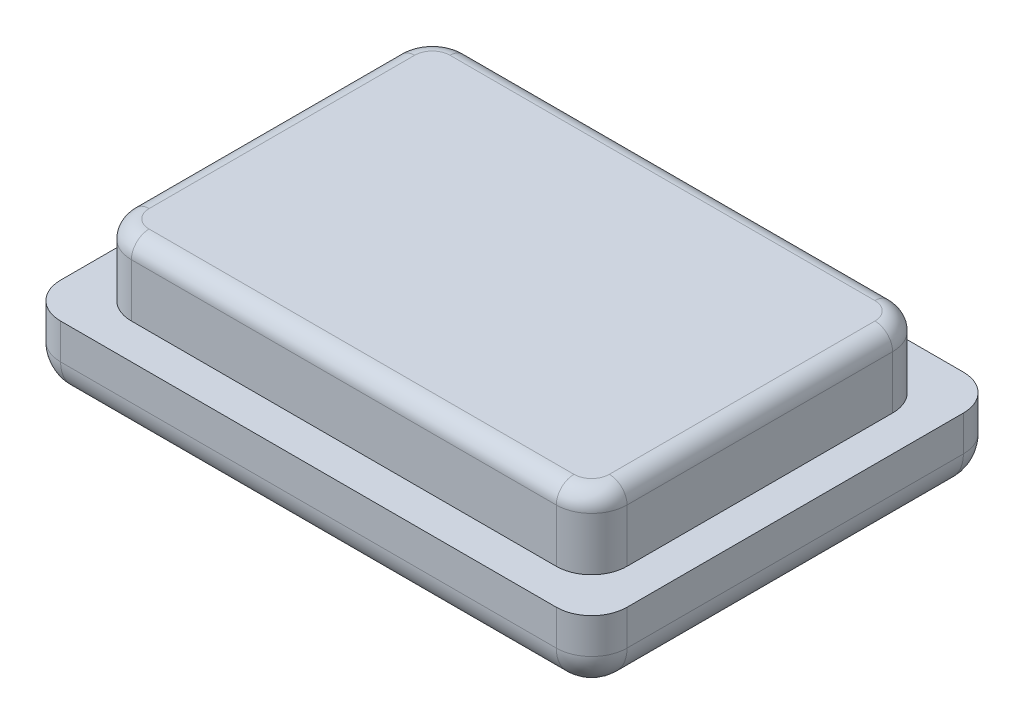
ISO-10303-21;
HEADER;
FILE_DESCRIPTION(('STEP AP214'),'2;1');
FILE_NAME('part.step','',(''),(''),'','','');
FILE_SCHEMA(('AUTOMOTIVE_DESIGN { 1 0 10303 214 1 1 1 1 }'));
ENDSEC;
DATA;
#1=APPLICATION_CONTEXT('core data for automotive mechanical design processes');
#2=APPLICATION_PROTOCOL_DEFINITION('international standard','automotive_design',2000,#1);
#3=PRODUCT_CONTEXT('',#1,'mechanical');
#4=PRODUCT('Part','Part','',(#3));
#5=PRODUCT_RELATED_PRODUCT_CATEGORY('part','',(#4));
#6=PRODUCT_DEFINITION_FORMATION('','',#4);
#7=PRODUCT_DEFINITION_CONTEXT('part definition',#1,'design');
#8=PRODUCT_DEFINITION('design','',#6,#7);
#9=PRODUCT_DEFINITION_SHAPE('','',#8);
#10=(LENGTH_UNIT() NAMED_UNIT(*) SI_UNIT(.MILLI.,.METRE.));
#11=(NAMED_UNIT(*) PLANE_ANGLE_UNIT() SI_UNIT($,.RADIAN.));
#12=(NAMED_UNIT(*) SI_UNIT($,.STERADIAN.) SOLID_ANGLE_UNIT());
#13=UNCERTAINTY_MEASURE_WITH_UNIT(LENGTH_MEASURE(1.E-05),#10,'distance_accuracy_value','');
#14=(GEOMETRIC_REPRESENTATION_CONTEXT(3) GLOBAL_UNCERTAINTY_ASSIGNED_CONTEXT((#13)) GLOBAL_UNIT_ASSIGNED_CONTEXT((#10,
#11,#12)) REPRESENTATION_CONTEXT('',''));
#15=CARTESIAN_POINT('',(0.,0.,0.));
#16=DIRECTION('',(0.,0.,1.));
#17=DIRECTION('',(1.,0.,0.));
#18=AXIS2_PLACEMENT_3D('',#15,#16,#17);
#19=CARTESIAN_POINT('',(0.,2.,0.));
#20=DIRECTION('',(0.,-1.,0.));
#21=DIRECTION('',(0.,0.,-1.));
#22=AXIS2_PLACEMENT_3D('',#19,#20,#21);
#23=PLANE('',#22);
#24=DIRECTION('',(0.,0.,-1.));
#25=VECTOR('',#24,1.);
#26=CARTESIAN_POINT('',(8.,2.,5.75000000000001));
#27=LINE('',#26,#25);
#28=CARTESIAN_POINT('',(8.,2.,4.75000000000001));
#29=VERTEX_POINT('',#28);
#30=CARTESIAN_POINT('',(8.,2.,-4.75));
#31=VERTEX_POINT('',#30);
#32=EDGE_CURVE('E210',#29,#31,#27,.T.);
#33=ORIENTED_EDGE('',*,*,#32,.T.);
#34=CARTESIAN_POINT('',(7.,2.,-4.75000000000001));
#35=DIRECTION('',(0.,-1.,0.));
#36=DIRECTION('',(0.,0.,-1.));
#37=AXIS2_PLACEMENT_3D('',#34,#35,#36);
#38=CIRCLE('',#37,1.);
#39=CARTESIAN_POINT('',(7.,2.,-5.75000000000001));
#40=VERTEX_POINT('',#39);
#41=EDGE_CURVE('E209',#31,#40,#38,.F.);
#42=ORIENTED_EDGE('',*,*,#41,.T.);
#43=DIRECTION('',(1.,0.,0.));
#44=VECTOR('',#43,1.);
#45=CARTESIAN_POINT('',(-8.,2.,-5.75000000000001));
#46=LINE('',#45,#44);
#47=CARTESIAN_POINT('',(-7.,2.,-5.75000000000001));
#48=VERTEX_POINT('',#47);
#49=EDGE_CURVE('E192',#48,#40,#46,.T.);
#50=ORIENTED_EDGE('',*,*,#49,.F.);
#51=CARTESIAN_POINT('',(-7.,2.,-4.75));
#52=DIRECTION('',(0.,-1.,0.));
#53=DIRECTION('',(0.,0.,-1.));
#54=AXIS2_PLACEMENT_3D('',#51,#52,#53);
#55=CIRCLE('',#54,1.);
#56=CARTESIAN_POINT('',(-8.,2.,-4.75));
#57=VERTEX_POINT('',#56);
#58=EDGE_CURVE('E206',#48,#57,#55,.F.);
#59=ORIENTED_EDGE('',*,*,#58,.T.);
#60=DIRECTION('',(0.,0.,-1.));
#61=VECTOR('',#60,1.);
#62=CARTESIAN_POINT('',(-8.,2.,5.75000000000001));
#63=LINE('',#62,#61);
#64=CARTESIAN_POINT('',(-8.,2.,4.75000000000001));
#65=VERTEX_POINT('',#64);
#66=EDGE_CURVE('E211',#65,#57,#63,.T.);
#67=ORIENTED_EDGE('',*,*,#66,.F.);
#68=CARTESIAN_POINT('',(-7.,2.,4.75000000000001));
#69=DIRECTION('',(0.,-1.,0.));
#70=DIRECTION('',(0.,0.,-1.));
#71=AXIS2_PLACEMENT_3D('',#68,#69,#70);
#72=CIRCLE('',#71,1.);
#73=CARTESIAN_POINT('',(-7.,2.,5.75000000000001));
#74=VERTEX_POINT('',#73);
#75=EDGE_CURVE('E216',#65,#74,#72,.F.);
#76=ORIENTED_EDGE('',*,*,#75,.T.);
#77=DIRECTION('',(1.,0.,0.));
#78=VECTOR('',#77,1.);
#79=CARTESIAN_POINT('',(-8.,2.,5.75000000000001));
#80=LINE('',#79,#78);
#81=CARTESIAN_POINT('',(7.,2.,5.75000000000001));
#82=VERTEX_POINT('',#81);
#83=EDGE_CURVE('E388',#74,#82,#80,.T.);
#84=ORIENTED_EDGE('',*,*,#83,.T.);
#85=CARTESIAN_POINT('',(7.,2.,4.75000000000001));
#86=DIRECTION('',(0.,-1.,0.));
#87=DIRECTION('',(0.,0.,-1.));
#88=AXIS2_PLACEMENT_3D('',#85,#86,#87);
#89=CIRCLE('',#88,1.);
#90=EDGE_CURVE('E219',#82,#29,#89,.F.);
#91=ORIENTED_EDGE('',*,*,#90,.T.);
#92=EDGE_LOOP('',(#33,#42,#50,#59,#67,#76,#84,#91));
#93=FACE_BOUND('',#92,.T.);
#94=DIRECTION('',(0.,0.,-1.));
#95=VECTOR('',#94,1.);
#96=CARTESIAN_POINT('',(7.,2.,4.75000000000001));
#97=LINE('',#96,#95);
#98=CARTESIAN_POINT('',(7.,2.,3.75));
#99=VERTEX_POINT('',#98);
#100=CARTESIAN_POINT('',(7.,2.,-3.75000000000001));
#101=VERTEX_POINT('',#100);
#102=EDGE_CURVE('E281',#99,#101,#97,.T.);
#103=ORIENTED_EDGE('',*,*,#102,.F.);
#104=CARTESIAN_POINT('',(6.,2.,3.75));
#105=DIRECTION('',(0.,-1.,0.));
#106=DIRECTION('',(0.,0.,-1.));
#107=AXIS2_PLACEMENT_3D('',#104,#105,#106);
#108=CIRCLE('',#107,1.);
#109=CARTESIAN_POINT('',(6.,2.,4.75000000000001));
#110=VERTEX_POINT('',#109);
#111=EDGE_CURVE('E299',#99,#110,#108,.T.);
#112=ORIENTED_EDGE('',*,*,#111,.T.);
#113=DIRECTION('',(1.,0.,0.));
#114=VECTOR('',#113,1.);
#115=CARTESIAN_POINT('',(-7.,2.,4.75000000000001));
#116=LINE('',#115,#114);
#117=CARTESIAN_POINT('',(-6.,2.,4.75000000000001));
#118=VERTEX_POINT('',#117);
#119=EDGE_CURVE('E377',#118,#110,#116,.T.);
#120=ORIENTED_EDGE('',*,*,#119,.F.);
#121=CARTESIAN_POINT('',(-6.,2.,3.75));
#122=DIRECTION('',(0.,-1.,0.));
#123=DIRECTION('',(0.,0.,-1.));
#124=AXIS2_PLACEMENT_3D('',#121,#122,#123);
#125=CIRCLE('',#124,1.);
#126=CARTESIAN_POINT('',(-7.,2.,3.75));
#127=VERTEX_POINT('',#126);
#128=EDGE_CURVE('E305',#118,#127,#125,.T.);
#129=ORIENTED_EDGE('',*,*,#128,.T.);
#130=DIRECTION('',(0.,0.,1.));
#131=VECTOR('',#130,1.);
#132=CARTESIAN_POINT('',(-7.,2.,4.75000000000001));
#133=LINE('',#132,#131);
#134=CARTESIAN_POINT('',(-7.,2.,-3.75000000000001));
#135=VERTEX_POINT('',#134);
#136=EDGE_CURVE('E375',#135,#127,#133,.T.);
#137=ORIENTED_EDGE('',*,*,#136,.F.);
#138=CARTESIAN_POINT('',(-6.,2.,-3.75000000000001));
#139=DIRECTION('',(0.,-1.,0.));
#140=DIRECTION('',(0.,0.,-1.));
#141=AXIS2_PLACEMENT_3D('',#138,#139,#140);
#142=CIRCLE('',#141,1.);
#143=CARTESIAN_POINT('',(-6.,2.,-4.75000000000001));
#144=VERTEX_POINT('',#143);
#145=EDGE_CURVE('E303',#135,#144,#142,.T.);
#146=ORIENTED_EDGE('',*,*,#145,.T.);
#147=DIRECTION('',(-1.,0.,0.));
#148=VECTOR('',#147,1.);
#149=CARTESIAN_POINT('',(-7.,2.,-4.75000000000001));
#150=LINE('',#149,#148);
#151=CARTESIAN_POINT('',(6.,2.,-4.75000000000001));
#152=VERTEX_POINT('',#151);
#153=EDGE_CURVE('E378',#152,#144,#150,.T.);
#154=ORIENTED_EDGE('',*,*,#153,.F.);
#155=CARTESIAN_POINT('',(6.,2.,-3.75));
#156=DIRECTION('',(0.,-1.,0.));
#157=DIRECTION('',(0.,0.,-1.));
#158=AXIS2_PLACEMENT_3D('',#155,#156,#157);
#159=CIRCLE('',#158,1.);
#160=EDGE_CURVE('E301',#152,#101,#159,.T.);
#161=ORIENTED_EDGE('',*,*,#160,.T.);
#162=EDGE_LOOP('',(#103,#112,#120,#129,#137,#146,#154,#161));
#163=FACE_BOUND('',#162,.T.);
#164=ADVANCED_FACE('F37',(#93,#163),#23,.F.);
#165=CARTESIAN_POINT('',(-8.,2.,5.75000000000001));
#166=DIRECTION('',(-1.,0.,0.));
#167=DIRECTION('',(0.,0.,1.));
#168=AXIS2_PLACEMENT_3D('',#165,#166,#167);
#169=PLANE('',#168);
#170=DIRECTION('',(0.,0.,-1.));
#171=VECTOR('',#170,1.);
#172=CARTESIAN_POINT('',(-8.,1.,5.75000000000001));
#173=LINE('',#172,#171);
#174=CARTESIAN_POINT('',(-8.,1.,-4.75));
#175=VERTEX_POINT('',#174);
#176=CARTESIAN_POINT('',(-8.,1.,4.75000000000001));
#177=VERTEX_POINT('',#176);
#178=EDGE_CURVE('E233',#175,#177,#173,.F.);
#179=ORIENTED_EDGE('',*,*,#178,.T.);
#180=DIRECTION('',(0.,-1.,0.));
#181=VECTOR('',#180,1.);
#182=CARTESIAN_POINT('',(-8.,2.,4.75000000000001));
#183=LINE('',#182,#181);
#184=EDGE_CURVE('E236',#177,#65,#183,.F.);
#185=ORIENTED_EDGE('',*,*,#184,.T.);
#186=ORIENTED_EDGE('',*,*,#66,.T.);
#187=DIRECTION('',(0.,-1.,0.));
#188=VECTOR('',#187,1.);
#189=CARTESIAN_POINT('',(-8.,2.,-4.75));
#190=LINE('',#189,#188);
#191=EDGE_CURVE('E215',#57,#175,#190,.T.);
#192=ORIENTED_EDGE('',*,*,#191,.T.);
#193=EDGE_LOOP('',(#179,#185,#186,#192));
#194=FACE_BOUND('',#193,.T.);
#195=ADVANCED_FACE('F434',(#194),#169,.T.);
#196=CARTESIAN_POINT('',(-8.,2.,5.75000000000001));
#197=DIRECTION('',(0.,0.,-1.));
#198=DIRECTION('',(-1.,0.,0.));
#199=AXIS2_PLACEMENT_3D('',#196,#197,#198);
#200=PLANE('',#199);
#201=DIRECTION('',(1.,0.,0.));
#202=VECTOR('',#201,1.);
#203=CARTESIAN_POINT('',(8.,1.,5.75000000000001));
#204=LINE('',#203,#202);
#205=CARTESIAN_POINT('',(-7.,1.,5.75000000000001));
#206=VERTEX_POINT('',#205);
#207=CARTESIAN_POINT('',(7.,1.,5.75000000000001));
#208=VERTEX_POINT('',#207);
#209=EDGE_CURVE('E227',#206,#208,#204,.T.);
#210=ORIENTED_EDGE('',*,*,#209,.T.);
#211=DIRECTION('',(0.,-1.,0.));
#212=VECTOR('',#211,1.);
#213=CARTESIAN_POINT('',(7.,2.,5.75000000000001));
#214=LINE('',#213,#212);
#215=EDGE_CURVE('E231',#208,#82,#214,.F.);
#216=ORIENTED_EDGE('',*,*,#215,.T.);
#217=ORIENTED_EDGE('',*,*,#83,.F.);
#218=DIRECTION('',(0.,-1.,0.));
#219=VECTOR('',#218,1.);
#220=CARTESIAN_POINT('',(-7.,0.,5.75000000000001));
#221=LINE('',#220,#219);
#222=EDGE_CURVE('E229',#74,#206,#221,.T.);
#223=ORIENTED_EDGE('',*,*,#222,.T.);
#224=EDGE_LOOP('',(#210,#216,#217,#223));
#225=FACE_BOUND('',#224,.T.);
#226=ADVANCED_FACE('F447',(#225),#200,.F.);
#227=CARTESIAN_POINT('',(8.,2.,5.75000000000001));
#228=DIRECTION('',(-1.,0.,0.));
#229=DIRECTION('',(0.,0.,1.));
#230=AXIS2_PLACEMENT_3D('',#227,#228,#229);
#231=PLANE('',#230);
#232=DIRECTION('',(0.,0.,-1.));
#233=VECTOR('',#232,1.);
#234=CARTESIAN_POINT('',(8.,1.,-5.75000000000001));
#235=LINE('',#234,#233);
#236=CARTESIAN_POINT('',(8.,1.,4.75000000000001));
#237=VERTEX_POINT('',#236);
#238=CARTESIAN_POINT('',(8.,1.,-4.75000000000001));
#239=VERTEX_POINT('',#238);
#240=EDGE_CURVE('E393',#237,#239,#235,.T.);
#241=ORIENTED_EDGE('',*,*,#240,.T.);
#242=DIRECTION('',(0.,-1.,0.));
#243=VECTOR('',#242,1.);
#244=CARTESIAN_POINT('',(8.,2.,-4.75000000000001));
#245=LINE('',#244,#243);
#246=EDGE_CURVE('E217',#239,#31,#245,.F.);
#247=ORIENTED_EDGE('',*,*,#246,.T.);
#248=ORIENTED_EDGE('',*,*,#32,.F.);
#249=DIRECTION('',(0.,-1.,0.));
#250=VECTOR('',#249,1.);
#251=CARTESIAN_POINT('',(8.,2.,4.75000000000001));
#252=LINE('',#251,#250);
#253=EDGE_CURVE('E221',#29,#237,#252,.T.);
#254=ORIENTED_EDGE('',*,*,#253,.T.);
#255=EDGE_LOOP('',(#241,#247,#248,#254));
#256=FACE_BOUND('',#255,.T.);
#257=ADVANCED_FACE('F398',(#256),#231,.F.);
#258=CARTESIAN_POINT('',(-8.,2.,-5.75000000000001));
#259=DIRECTION('',(0.,0.,-1.));
#260=DIRECTION('',(-1.,0.,0.));
#261=AXIS2_PLACEMENT_3D('',#258,#259,#260);
#262=PLANE('',#261);
#263=ORIENTED_EDGE('',*,*,#49,.T.);
#264=DIRECTION('',(0.,-1.,0.));
#265=VECTOR('',#264,1.);
#266=CARTESIAN_POINT('',(7.,0.,-5.75000000000001));
#267=LINE('',#266,#265);
#268=CARTESIAN_POINT('',(7.,1.,-5.75000000000001));
#269=VERTEX_POINT('',#268);
#270=EDGE_CURVE('E200',#40,#269,#267,.T.);
#271=ORIENTED_EDGE('',*,*,#270,.T.);
#272=DIRECTION('',(1.,0.,0.));
#273=VECTOR('',#272,1.);
#274=CARTESIAN_POINT('',(-8.,1.,-5.75000000000001));
#275=LINE('',#274,#273);
#276=CARTESIAN_POINT('',(-7.,1.,-5.75000000000001));
#277=VERTEX_POINT('',#276);
#278=EDGE_CURVE('E195',#269,#277,#275,.F.);
#279=ORIENTED_EDGE('',*,*,#278,.T.);
#280=DIRECTION('',(0.,-1.,0.));
#281=VECTOR('',#280,1.);
#282=CARTESIAN_POINT('',(-7.,2.,-5.75000000000001));
#283=LINE('',#282,#281);
#284=EDGE_CURVE('E188',#277,#48,#283,.F.);
#285=ORIENTED_EDGE('',*,*,#284,.T.);
#286=EDGE_LOOP('',(#263,#271,#279,#285));
#287=FACE_BOUND('',#286,.T.);
#288=ADVANCED_FACE('F190',(#287),#262,.T.);
#289=CARTESIAN_POINT('',(0.,0.,0.));
#290=DIRECTION('',(0.,-1.,0.));
#291=DIRECTION('',(0.,0.,-1.));
#292=AXIS2_PLACEMENT_3D('',#289,#290,#291);
#293=PLANE('',#292);
#294=DIRECTION('',(1.,0.,0.));
#295=VECTOR('',#294,1.);
#296=CARTESIAN_POINT('',(0.,0.,-4.75000000000001));
#297=LINE('',#296,#295);
#298=CARTESIAN_POINT('',(-7.,0.,-4.75000000000001));
#299=VERTEX_POINT('',#298);
#300=CARTESIAN_POINT('',(7.,0.,-4.75000000000001));
#301=VERTEX_POINT('',#300);
#302=EDGE_CURVE('E242',#299,#301,#297,.T.);
#303=ORIENTED_EDGE('',*,*,#302,.T.);
#304=DIRECTION('',(0.,0.,-1.));
#305=VECTOR('',#304,1.);
#306=CARTESIAN_POINT('',(7.,0.,5.75000000000001));
#307=LINE('',#306,#305);
#308=CARTESIAN_POINT('',(7.,0.,4.75000000000001));
#309=VERTEX_POINT('',#308);
#310=EDGE_CURVE('E244',#301,#309,#307,.F.);
#311=ORIENTED_EDGE('',*,*,#310,.T.);
#312=DIRECTION('',(1.,0.,0.));
#313=VECTOR('',#312,1.);
#314=CARTESIAN_POINT('',(-8.,0.,4.75000000000001));
#315=LINE('',#314,#313);
#316=CARTESIAN_POINT('',(-7.,0.,4.75000000000001));
#317=VERTEX_POINT('',#316);
#318=EDGE_CURVE('E238',#309,#317,#315,.F.);
#319=ORIENTED_EDGE('',*,*,#318,.T.);
#320=DIRECTION('',(0.,0.,-1.));
#321=VECTOR('',#320,1.);
#322=CARTESIAN_POINT('',(-7.,0.,0.));
#323=LINE('',#322,#321);
#324=EDGE_CURVE('E240',#317,#299,#323,.T.);
#325=ORIENTED_EDGE('',*,*,#324,.T.);
#326=EDGE_LOOP('',(#303,#311,#319,#325));
#327=FACE_BOUND('',#326,.T.);
#328=ADVANCED_FACE('F465',(#327),#293,.T.);
#329=CARTESIAN_POINT('',(7.,4.,4.75000000000001));
#330=DIRECTION('',(-1.,0.,0.));
#331=DIRECTION('',(0.,0.,1.));
#332=AXIS2_PLACEMENT_3D('',#329,#330,#331);
#333=PLANE('',#332);
#334=DIRECTION('',(0.,-1.,0.));
#335=VECTOR('',#334,1.);
#336=CARTESIAN_POINT('',(7.,4.,-3.75000000000001));
#337=LINE('',#336,#335);
#338=CARTESIAN_POINT('',(7.,3.5,-3.75000000000001));
#339=VERTEX_POINT('',#338);
#340=EDGE_CURVE('E247',#101,#339,#337,.F.);
#341=ORIENTED_EDGE('',*,*,#340,.T.);
#342=DIRECTION('',(0.,0.,-1.));
#343=VECTOR('',#342,1.);
#344=CARTESIAN_POINT('',(7.,3.5,4.75000000000001));
#345=LINE('',#344,#343);
#346=CARTESIAN_POINT('',(7.,3.5,3.75));
#347=VERTEX_POINT('',#346);
#348=EDGE_CURVE('E327',#339,#347,#345,.F.);
#349=ORIENTED_EDGE('',*,*,#348,.T.);
#350=DIRECTION('',(0.,-1.,0.));
#351=VECTOR('',#350,1.);
#352=CARTESIAN_POINT('',(7.,4.,3.75));
#353=LINE('',#352,#351);
#354=EDGE_CURVE('E284',#347,#99,#353,.T.);
#355=ORIENTED_EDGE('',*,*,#354,.T.);
#356=ORIENTED_EDGE('',*,*,#102,.T.);
#357=EDGE_LOOP('',(#341,#349,#355,#356));
#358=FACE_BOUND('',#357,.T.);
#359=ADVANCED_FACE('F463',(#358),#333,.F.);
#360=CARTESIAN_POINT('',(-7.,4.,-4.75000000000001));
#361=DIRECTION('',(0.,0.,1.));
#362=DIRECTION('',(1.,0.,0.));
#363=AXIS2_PLACEMENT_3D('',#360,#361,#362);
#364=PLANE('',#363);
#365=DIRECTION('',(0.,-1.,0.));
#366=VECTOR('',#365,1.);
#367=CARTESIAN_POINT('',(-6.,4.,-4.75000000000001));
#368=LINE('',#367,#366);
#369=CARTESIAN_POINT('',(-6.,3.5,-4.75000000000001));
#370=VERTEX_POINT('',#369);
#371=EDGE_CURVE('E291',#144,#370,#368,.F.);
#372=ORIENTED_EDGE('',*,*,#371,.T.);
#373=DIRECTION('',(-1.,0.,0.));
#374=VECTOR('',#373,1.);
#375=CARTESIAN_POINT('',(-7.,3.5,-4.75000000000001));
#376=LINE('',#375,#374);
#377=CARTESIAN_POINT('',(6.,3.5,-4.75000000000001));
#378=VERTEX_POINT('',#377);
#379=EDGE_CURVE('E11',#370,#378,#376,.F.);
#380=ORIENTED_EDGE('',*,*,#379,.T.);
#381=DIRECTION('',(0.,-1.,0.));
#382=VECTOR('',#381,1.);
#383=CARTESIAN_POINT('',(6.,4.,-4.75000000000001));
#384=LINE('',#383,#382);
#385=EDGE_CURVE('E293',#378,#152,#384,.T.);
#386=ORIENTED_EDGE('',*,*,#385,.T.);
#387=ORIENTED_EDGE('',*,*,#153,.T.);
#388=EDGE_LOOP('',(#372,#380,#386,#387));
#389=FACE_BOUND('',#388,.T.);
#390=ADVANCED_FACE('F472',(#389),#364,.F.);
#391=CARTESIAN_POINT('',(-7.,4.,4.75000000000001));
#392=DIRECTION('',(1.,0.,0.));
#393=DIRECTION('',(0.,0.,-1.));
#394=AXIS2_PLACEMENT_3D('',#391,#392,#393);
#395=PLANE('',#394);
#396=DIRECTION('',(0.,-1.,0.));
#397=VECTOR('',#396,1.);
#398=CARTESIAN_POINT('',(-7.,4.,3.75));
#399=LINE('',#398,#397);
#400=CARTESIAN_POINT('',(-7.,3.5,3.75));
#401=VERTEX_POINT('',#400);
#402=EDGE_CURVE('E295',#127,#401,#399,.F.);
#403=ORIENTED_EDGE('',*,*,#402,.T.);
#404=DIRECTION('',(0.,0.,1.));
#405=VECTOR('',#404,1.);
#406=CARTESIAN_POINT('',(-7.,3.5,4.75000000000001));
#407=LINE('',#406,#405);
#408=CARTESIAN_POINT('',(-7.,3.5,-3.75000000000001));
#409=VERTEX_POINT('',#408);
#410=EDGE_CURVE('E61',#401,#409,#407,.F.);
#411=ORIENTED_EDGE('',*,*,#410,.T.);
#412=DIRECTION('',(0.,-1.,0.));
#413=VECTOR('',#412,1.);
#414=CARTESIAN_POINT('',(-7.,4.,-3.75000000000001));
#415=LINE('',#414,#413);
#416=EDGE_CURVE('E297',#409,#135,#415,.T.);
#417=ORIENTED_EDGE('',*,*,#416,.T.);
#418=ORIENTED_EDGE('',*,*,#136,.T.);
#419=EDGE_LOOP('',(#403,#411,#417,#418));
#420=FACE_BOUND('',#419,.T.);
#421=ADVANCED_FACE('F373',(#420),#395,.F.);
#422=CARTESIAN_POINT('',(-7.,4.,4.75000000000001));
#423=DIRECTION('',(0.,0.,-1.));
#424=DIRECTION('',(-1.,0.,0.));
#425=AXIS2_PLACEMENT_3D('',#422,#423,#424);
#426=PLANE('',#425);
#427=DIRECTION('',(0.,-1.,0.));
#428=VECTOR('',#427,1.);
#429=CARTESIAN_POINT('',(6.,4.,4.75000000000001));
#430=LINE('',#429,#428);
#431=CARTESIAN_POINT('',(6.,3.5,4.75000000000001));
#432=VERTEX_POINT('',#431);
#433=EDGE_CURVE('E288',#110,#432,#430,.F.);
#434=ORIENTED_EDGE('',*,*,#433,.T.);
#435=DIRECTION('',(1.,0.,0.));
#436=VECTOR('',#435,1.);
#437=CARTESIAN_POINT('',(-7.,3.5,4.75000000000001));
#438=LINE('',#437,#436);
#439=CARTESIAN_POINT('',(-6.,3.5,4.75000000000001));
#440=VERTEX_POINT('',#439);
#441=EDGE_CURVE('E331',#432,#440,#438,.F.);
#442=ORIENTED_EDGE('',*,*,#441,.T.);
#443=DIRECTION('',(0.,-1.,0.));
#444=VECTOR('',#443,1.);
#445=CARTESIAN_POINT('',(-6.,4.,4.75000000000001));
#446=LINE('',#445,#444);
#447=EDGE_CURVE('E286',#440,#118,#446,.T.);
#448=ORIENTED_EDGE('',*,*,#447,.T.);
#449=ORIENTED_EDGE('',*,*,#119,.T.);
#450=EDGE_LOOP('',(#434,#442,#448,#449));
#451=FACE_BOUND('',#450,.T.);
#452=ADVANCED_FACE('F620',(#451),#426,.F.);
#453=CARTESIAN_POINT('',(0.,4.,0.));
#454=DIRECTION('',(0.,-1.,0.));
#455=DIRECTION('',(0.,0.,-1.));
#456=AXIS2_PLACEMENT_3D('',#453,#454,#455);
#457=PLANE('',#456);
#458=DIRECTION('',(0.,0.,-1.));
#459=VECTOR('',#458,1.);
#460=CARTESIAN_POINT('',(6.5,4.,0.));
#461=LINE('',#460,#459);
#462=CARTESIAN_POINT('',(6.5,4.,3.75));
#463=VERTEX_POINT('',#462);
#464=CARTESIAN_POINT('',(6.5,4.,-3.75000000000001));
#465=VERTEX_POINT('',#464);
#466=EDGE_CURVE('E319',#463,#465,#461,.T.);
#467=ORIENTED_EDGE('',*,*,#466,.T.);
#468=CARTESIAN_POINT('',(6.,4.,-3.75));
#469=DIRECTION('',(0.,-1.,0.));
#470=DIRECTION('',(0.,0.,-1.));
#471=AXIS2_PLACEMENT_3D('',#468,#469,#470);
#472=CIRCLE('',#471,0.5);
#473=CARTESIAN_POINT('',(6.,4.,-4.25000000000001));
#474=VERTEX_POINT('',#473);
#475=EDGE_CURVE('E321',#465,#474,#472,.F.);
#476=ORIENTED_EDGE('',*,*,#475,.T.);
#477=DIRECTION('',(-1.,0.,0.));
#478=VECTOR('',#477,1.);
#479=CARTESIAN_POINT('',(0.,4.,-4.25000000000001));
#480=LINE('',#479,#478);
#481=CARTESIAN_POINT('',(-6.,4.,-4.25000000000001));
#482=VERTEX_POINT('',#481);
#483=EDGE_CURVE('E307',#474,#482,#480,.T.);
#484=ORIENTED_EDGE('',*,*,#483,.T.);
#485=CARTESIAN_POINT('',(-6.,4.,-3.75000000000001));
#486=DIRECTION('',(0.,-1.,0.));
#487=DIRECTION('',(0.,0.,-1.));
#488=AXIS2_PLACEMENT_3D('',#485,#486,#487);
#489=CIRCLE('',#488,0.5);
#490=CARTESIAN_POINT('',(-6.5,4.,-3.75000000000001));
#491=VERTEX_POINT('',#490);
#492=EDGE_CURVE('E309',#482,#491,#489,.F.);
#493=ORIENTED_EDGE('',*,*,#492,.T.);
#494=DIRECTION('',(0.,0.,1.));
#495=VECTOR('',#494,1.);
#496=CARTESIAN_POINT('',(-6.5,4.,0.));
#497=LINE('',#496,#495);
#498=CARTESIAN_POINT('',(-6.5,4.,3.75));
#499=VERTEX_POINT('',#498);
#500=EDGE_CURVE('E311',#491,#499,#497,.T.);
#501=ORIENTED_EDGE('',*,*,#500,.T.);
#502=CARTESIAN_POINT('',(-6.,4.,3.75));
#503=DIRECTION('',(0.,-1.,0.));
#504=DIRECTION('',(0.,0.,-1.));
#505=AXIS2_PLACEMENT_3D('',#502,#503,#504);
#506=CIRCLE('',#505,0.5);
#507=CARTESIAN_POINT('',(-6.,4.,4.25000000000001));
#508=VERTEX_POINT('',#507);
#509=EDGE_CURVE('E313',#499,#508,#506,.F.);
#510=ORIENTED_EDGE('',*,*,#509,.T.);
#511=DIRECTION('',(1.,0.,0.));
#512=VECTOR('',#511,1.);
#513=CARTESIAN_POINT('',(0.,4.,4.25000000000001));
#514=LINE('',#513,#512);
#515=CARTESIAN_POINT('',(6.,4.,4.25000000000001));
#516=VERTEX_POINT('',#515);
#517=EDGE_CURVE('E315',#508,#516,#514,.T.);
#518=ORIENTED_EDGE('',*,*,#517,.T.);
#519=CARTESIAN_POINT('',(6.,4.,3.75));
#520=DIRECTION('',(0.,-1.,0.));
#521=DIRECTION('',(0.,0.,-1.));
#522=AXIS2_PLACEMENT_3D('',#519,#520,#521);
#523=CIRCLE('',#522,0.5);
#524=EDGE_CURVE('E317',#516,#463,#523,.F.);
#525=ORIENTED_EDGE('',*,*,#524,.T.);
#526=EDGE_LOOP('',(#467,#476,#484,#493,#501,#510,#518,#525));
#527=FACE_BOUND('',#526,.T.);
#528=ADVANCED_FACE('F503',(#527),#457,.F.);
#529=CARTESIAN_POINT('',(-7.,2.,4.75000000000001));
#530=DIRECTION('',(0.,1.,0.));
#531=DIRECTION('',(0.,0.,1.));
#532=AXIS2_PLACEMENT_3D('',#529,#530,#531);
#533=CYLINDRICAL_SURFACE('',#532,1.);
#534=CARTESIAN_POINT('',(-7.,1.,4.75000000000001));
#535=DIRECTION('',(0.,-1.,0.));
#536=DIRECTION('',(0.,0.,-1.));
#537=AXIS2_PLACEMENT_3D('',#534,#535,#536);
#538=CIRCLE('',#537,1.);
#539=EDGE_CURVE('E278',#206,#177,#538,.T.);
#540=ORIENTED_EDGE('',*,*,#539,.F.);
#541=ORIENTED_EDGE('',*,*,#222,.F.);
#542=ORIENTED_EDGE('',*,*,#75,.F.);
#543=ORIENTED_EDGE('',*,*,#184,.F.);
#544=EDGE_LOOP('',(#540,#541,#542,#543));
#545=FACE_BOUND('',#544,.T.);
#546=ADVANCED_FACE('F438',(#545),#533,.T.);
#547=CARTESIAN_POINT('',(-7.,1.,4.75000000000001));
#548=DIRECTION('',(0.,0.,1.));
#549=DIRECTION('',(1.,0.,0.));
#550=AXIS2_PLACEMENT_3D('',#547,#548,#549);
#551=SPHERICAL_SURFACE('',#550,1.);
#552=CARTESIAN_POINT('',(-7.,1.,4.75000000000001));
#553=DIRECTION('',(-1.,0.,0.));
#554=DIRECTION('',(0.,0.,1.));
#555=AXIS2_PLACEMENT_3D('',#552,#553,#554);
#556=CIRCLE('',#555,1.);
#557=EDGE_CURVE('E272',#206,#317,#556,.F.);
#558=ORIENTED_EDGE('',*,*,#557,.F.);
#559=ORIENTED_EDGE('',*,*,#539,.T.);
#560=CARTESIAN_POINT('',(-7.,1.,4.75000000000001));
#561=DIRECTION('',(0.,0.,1.));
#562=DIRECTION('',(1.,0.,0.));
#563=AXIS2_PLACEMENT_3D('',#560,#561,#562);
#564=CIRCLE('',#563,1.);
#565=EDGE_CURVE('E275',#317,#177,#564,.F.);
#566=ORIENTED_EDGE('',*,*,#565,.F.);
#567=EDGE_LOOP('',(#558,#559,#566));
#568=FACE_BOUND('',#567,.T.);
#569=ADVANCED_FACE('F442',(#568),#551,.T.);
#570=CARTESIAN_POINT('',(-7.,2.,-4.75));
#571=DIRECTION('',(0.,-1.,0.));
#572=DIRECTION('',(0.,0.,-1.));
#573=AXIS2_PLACEMENT_3D('',#570,#571,#572);
#574=CYLINDRICAL_SURFACE('',#573,1.);
#575=ORIENTED_EDGE('',*,*,#58,.F.);
#576=ORIENTED_EDGE('',*,*,#284,.F.);
#577=CARTESIAN_POINT('',(-7.,1.,-4.75));
#578=DIRECTION('',(0.,-1.,0.));
#579=DIRECTION('',(0.,0.,-1.));
#580=AXIS2_PLACEMENT_3D('',#577,#578,#579);
#581=CIRCLE('',#580,1.);
#582=EDGE_CURVE('E270',#175,#277,#581,.T.);
#583=ORIENTED_EDGE('',*,*,#582,.F.);
#584=ORIENTED_EDGE('',*,*,#191,.F.);
#585=EDGE_LOOP('',(#575,#576,#583,#584));
#586=FACE_BOUND('',#585,.T.);
#587=ADVANCED_FACE('F214',(#586),#574,.T.);
#588=CARTESIAN_POINT('',(-7.,1.,0.));
#589=DIRECTION('',(0.,0.,-1.));
#590=DIRECTION('',(-1.,0.,0.));
#591=AXIS2_PLACEMENT_3D('',#588,#589,#590);
#592=CYLINDRICAL_SURFACE('',#591,1.);
#593=ORIENTED_EDGE('',*,*,#565,.T.);
#594=ORIENTED_EDGE('',*,*,#178,.F.);
#595=CARTESIAN_POINT('',(-7.,1.,-4.75000000000001));
#596=DIRECTION('',(0.,0.,-1.));
#597=DIRECTION('',(-1.,0.,0.));
#598=AXIS2_PLACEMENT_3D('',#595,#596,#597);
#599=CIRCLE('',#598,1.);
#600=EDGE_CURVE('E267',#299,#175,#599,.T.);
#601=ORIENTED_EDGE('',*,*,#600,.F.);
#602=ORIENTED_EDGE('',*,*,#324,.F.);
#603=EDGE_LOOP('',(#593,#594,#601,#602));
#604=FACE_BOUND('',#603,.T.);
#605=ADVANCED_FACE('F430',(#604),#592,.T.);
#606=CARTESIAN_POINT('',(-8.,1.,4.75000000000001));
#607=DIRECTION('',(-1.,0.,0.));
#608=DIRECTION('',(0.,0.,1.));
#609=AXIS2_PLACEMENT_3D('',#606,#607,#608);
#610=CYLINDRICAL_SURFACE('',#609,1.);
#611=ORIENTED_EDGE('',*,*,#557,.T.);
#612=ORIENTED_EDGE('',*,*,#318,.F.);
#613=CARTESIAN_POINT('',(7.,1.,4.75000000000001));
#614=DIRECTION('',(1.,0.,0.));
#615=DIRECTION('',(0.,0.,-1.));
#616=AXIS2_PLACEMENT_3D('',#613,#614,#615);
#617=CIRCLE('',#616,1.);
#618=EDGE_CURVE('E264',#208,#309,#617,.T.);
#619=ORIENTED_EDGE('',*,*,#618,.F.);
#620=ORIENTED_EDGE('',*,*,#209,.F.);
#621=EDGE_LOOP('',(#611,#612,#619,#620));
#622=FACE_BOUND('',#621,.T.);
#623=ADVANCED_FACE('F445',(#622),#610,.T.);
#624=CARTESIAN_POINT('',(7.,2.,4.75000000000001));
#625=DIRECTION('',(0.,-1.,0.));
#626=DIRECTION('',(0.,0.,-1.));
#627=AXIS2_PLACEMENT_3D('',#624,#625,#626);
#628=CYLINDRICAL_SURFACE('',#627,1.);
#629=ORIENTED_EDGE('',*,*,#90,.F.);
#630=ORIENTED_EDGE('',*,*,#215,.F.);
#631=CARTESIAN_POINT('',(7.,1.,4.75000000000001));
#632=DIRECTION('',(0.,-1.,0.));
#633=DIRECTION('',(0.,0.,-1.));
#634=AXIS2_PLACEMENT_3D('',#631,#632,#633);
#635=CIRCLE('',#634,1.);
#636=EDGE_CURVE('E261',#237,#208,#635,.T.);
#637=ORIENTED_EDGE('',*,*,#636,.F.);
#638=ORIENTED_EDGE('',*,*,#253,.F.);
#639=EDGE_LOOP('',(#629,#630,#637,#638));
#640=FACE_BOUND('',#639,.T.);
#641=ADVANCED_FACE('F405',(#640),#628,.T.);
#642=CARTESIAN_POINT('',(-7.,1.,-4.75000000000001));
#643=DIRECTION('',(0.,0.,1.));
#644=DIRECTION('',(1.,0.,0.));
#645=AXIS2_PLACEMENT_3D('',#642,#643,#644);
#646=SPHERICAL_SURFACE('',#645,1.);
#647=ORIENTED_EDGE('',*,*,#600,.T.);
#648=ORIENTED_EDGE('',*,*,#582,.T.);
#649=CARTESIAN_POINT('',(-7.,1.,-4.75000000000001));
#650=DIRECTION('',(-1.,0.,0.));
#651=DIRECTION('',(0.,0.,1.));
#652=AXIS2_PLACEMENT_3D('',#649,#650,#651);
#653=CIRCLE('',#652,1.);
#654=EDGE_CURVE('E258',#299,#277,#653,.F.);
#655=ORIENTED_EDGE('',*,*,#654,.F.);
#656=EDGE_LOOP('',(#647,#648,#655));
#657=FACE_BOUND('',#656,.T.);
#658=ADVANCED_FACE('F425',(#657),#646,.T.);
#659=CARTESIAN_POINT('',(7.,1.,4.75000000000001));
#660=DIRECTION('',(0.,0.,1.));
#661=DIRECTION('',(1.,0.,0.));
#662=AXIS2_PLACEMENT_3D('',#659,#660,#661);
#663=SPHERICAL_SURFACE('',#662,1.);
#664=ORIENTED_EDGE('',*,*,#636,.T.);
#665=ORIENTED_EDGE('',*,*,#618,.T.);
#666=CARTESIAN_POINT('',(7.,1.,4.75000000000001));
#667=DIRECTION('',(0.,0.,1.));
#668=DIRECTION('',(1.,0.,0.));
#669=AXIS2_PLACEMENT_3D('',#666,#667,#668);
#670=CIRCLE('',#669,1.);
#671=EDGE_CURVE('E256',#237,#309,#670,.F.);
#672=ORIENTED_EDGE('',*,*,#671,.F.);
#673=EDGE_LOOP('',(#664,#665,#672));
#674=FACE_BOUND('',#673,.T.);
#675=ADVANCED_FACE('F408',(#674),#663,.T.);
#676=CARTESIAN_POINT('',(0.,1.,-4.75000000000001));
#677=DIRECTION('',(1.,0.,0.));
#678=DIRECTION('',(0.,0.,-1.));
#679=AXIS2_PLACEMENT_3D('',#676,#677,#678);
#680=CYLINDRICAL_SURFACE('',#679,1.);
#681=ORIENTED_EDGE('',*,*,#654,.T.);
#682=ORIENTED_EDGE('',*,*,#278,.F.);
#683=CARTESIAN_POINT('',(7.,1.,-4.75000000000001));
#684=DIRECTION('',(1.,0.,0.));
#685=DIRECTION('',(0.,0.,-1.));
#686=AXIS2_PLACEMENT_3D('',#683,#684,#685);
#687=CIRCLE('',#686,1.);
#688=EDGE_CURVE('E253',#301,#269,#687,.T.);
#689=ORIENTED_EDGE('',*,*,#688,.F.);
#690=ORIENTED_EDGE('',*,*,#302,.F.);
#691=EDGE_LOOP('',(#681,#682,#689,#690));
#692=FACE_BOUND('',#691,.T.);
#693=ADVANCED_FACE('F422',(#692),#680,.T.);
#694=CARTESIAN_POINT('',(7.,1.,5.75000000000001));
#695=DIRECTION('',(0.,0.,1.));
#696=DIRECTION('',(1.,0.,0.));
#697=AXIS2_PLACEMENT_3D('',#694,#695,#696);
#698=CYLINDRICAL_SURFACE('',#697,1.);
#699=ORIENTED_EDGE('',*,*,#671,.T.);
#700=ORIENTED_EDGE('',*,*,#310,.F.);
#701=CARTESIAN_POINT('',(7.,1.,-4.75000000000001));
#702=DIRECTION('',(0.,0.,-1.));
#703=DIRECTION('',(-1.,0.,0.));
#704=AXIS2_PLACEMENT_3D('',#701,#702,#703);
#705=CIRCLE('',#704,1.);
#706=EDGE_CURVE('E250',#239,#301,#705,.T.);
#707=ORIENTED_EDGE('',*,*,#706,.F.);
#708=ORIENTED_EDGE('',*,*,#240,.F.);
#709=EDGE_LOOP('',(#699,#700,#707,#708));
#710=FACE_BOUND('',#709,.T.);
#711=ADVANCED_FACE('F412',(#710),#698,.T.);
#712=CARTESIAN_POINT('',(7.,1.,-4.75000000000001));
#713=DIRECTION('',(0.,0.,1.));
#714=DIRECTION('',(1.,0.,0.));
#715=AXIS2_PLACEMENT_3D('',#712,#713,#714);
#716=SPHERICAL_SURFACE('',#715,1.);
#717=ORIENTED_EDGE('',*,*,#706,.T.);
#718=ORIENTED_EDGE('',*,*,#688,.T.);
#719=CARTESIAN_POINT('',(7.,1.,-4.75000000000001));
#720=DIRECTION('',(0.,-1.,0.));
#721=DIRECTION('',(0.,0.,-1.));
#722=AXIS2_PLACEMENT_3D('',#719,#720,#721);
#723=CIRCLE('',#722,1.);
#724=EDGE_CURVE('E248',#239,#269,#723,.F.);
#725=ORIENTED_EDGE('',*,*,#724,.F.);
#726=EDGE_LOOP('',(#717,#718,#725));
#727=FACE_BOUND('',#726,.T.);
#728=ADVANCED_FACE('F419',(#727),#716,.T.);
#729=CARTESIAN_POINT('',(7.,2.,-4.75000000000001));
#730=DIRECTION('',(0.,1.,0.));
#731=DIRECTION('',(0.,0.,1.));
#732=AXIS2_PLACEMENT_3D('',#729,#730,#731);
#733=CYLINDRICAL_SURFACE('',#732,1.);
#734=ORIENTED_EDGE('',*,*,#41,.F.);
#735=ORIENTED_EDGE('',*,*,#246,.F.);
#736=ORIENTED_EDGE('',*,*,#724,.T.);
#737=ORIENTED_EDGE('',*,*,#270,.F.);
#738=EDGE_LOOP('',(#734,#735,#736,#737));
#739=FACE_BOUND('',#738,.T.);
#740=ADVANCED_FACE('F418',(#739),#733,.T.);
#741=CARTESIAN_POINT('',(6.,4.,3.75));
#742=DIRECTION('',(0.,-1.,0.));
#743=DIRECTION('',(0.,0.,-1.));
#744=AXIS2_PLACEMENT_3D('',#741,#742,#743);
#745=CYLINDRICAL_SURFACE('',#744,1.);
#746=ORIENTED_EDGE('',*,*,#354,.F.);
#747=CARTESIAN_POINT('',(6.,3.5,3.75));
#748=DIRECTION('',(0.,-1.,0.));
#749=DIRECTION('',(0.,0.,-1.));
#750=AXIS2_PLACEMENT_3D('',#747,#748,#749);
#751=CIRCLE('',#750,1.);
#752=EDGE_CURVE('E329',#347,#432,#751,.T.);
#753=ORIENTED_EDGE('',*,*,#752,.T.);
#754=ORIENTED_EDGE('',*,*,#433,.F.);
#755=ORIENTED_EDGE('',*,*,#111,.F.);
#756=EDGE_LOOP('',(#746,#753,#754,#755));
#757=FACE_BOUND('',#756,.T.);
#758=ADVANCED_FACE('F480',(#757),#745,.T.);
#759=CARTESIAN_POINT('',(6.,4.,-3.75));
#760=DIRECTION('',(0.,-1.,0.));
#761=DIRECTION('',(0.,0.,-1.));
#762=AXIS2_PLACEMENT_3D('',#759,#760,#761);
#763=CYLINDRICAL_SURFACE('',#762,1.);
#764=ORIENTED_EDGE('',*,*,#385,.F.);
#765=CARTESIAN_POINT('',(6.,3.5,-3.75));
#766=DIRECTION('',(0.,-1.,0.));
#767=DIRECTION('',(0.,0.,-1.));
#768=AXIS2_PLACEMENT_3D('',#765,#766,#767);
#769=CIRCLE('',#768,1.);
#770=EDGE_CURVE('E324',#378,#339,#769,.T.);
#771=ORIENTED_EDGE('',*,*,#770,.T.);
#772=ORIENTED_EDGE('',*,*,#340,.F.);
#773=ORIENTED_EDGE('',*,*,#160,.F.);
#774=EDGE_LOOP('',(#764,#771,#772,#773));
#775=FACE_BOUND('',#774,.T.);
#776=ADVANCED_FACE('F506',(#775),#763,.T.);
#777=CARTESIAN_POINT('',(-6.,4.,-3.75000000000001));
#778=DIRECTION('',(0.,-1.,0.));
#779=DIRECTION('',(0.,0.,-1.));
#780=AXIS2_PLACEMENT_3D('',#777,#778,#779);
#781=CYLINDRICAL_SURFACE('',#780,1.);
#782=ORIENTED_EDGE('',*,*,#416,.F.);
#783=CARTESIAN_POINT('',(-6.,3.5,-3.75000000000001));
#784=DIRECTION('',(0.,-1.,0.));
#785=DIRECTION('',(0.,0.,-1.));
#786=AXIS2_PLACEMENT_3D('',#783,#784,#785);
#787=CIRCLE('',#786,1.);
#788=EDGE_CURVE('E46',#409,#370,#787,.T.);
#789=ORIENTED_EDGE('',*,*,#788,.T.);
#790=ORIENTED_EDGE('',*,*,#371,.F.);
#791=ORIENTED_EDGE('',*,*,#145,.F.);
#792=EDGE_LOOP('',(#782,#789,#790,#791));
#793=FACE_BOUND('',#792,.T.);
#794=ADVANCED_FACE('F510',(#793),#781,.T.);
#795=CARTESIAN_POINT('',(-6.,4.,3.75));
#796=DIRECTION('',(0.,-1.,0.));
#797=DIRECTION('',(0.,0.,-1.));
#798=AXIS2_PLACEMENT_3D('',#795,#796,#797);
#799=CYLINDRICAL_SURFACE('',#798,1.);
#800=ORIENTED_EDGE('',*,*,#447,.F.);
#801=CARTESIAN_POINT('',(-6.,3.5,3.75));
#802=DIRECTION('',(0.,-1.,0.));
#803=DIRECTION('',(0.,0.,-1.));
#804=AXIS2_PLACEMENT_3D('',#801,#802,#803);
#805=CIRCLE('',#804,1.);
#806=EDGE_CURVE('E333',#440,#401,#805,.T.);
#807=ORIENTED_EDGE('',*,*,#806,.T.);
#808=ORIENTED_EDGE('',*,*,#402,.F.);
#809=ORIENTED_EDGE('',*,*,#128,.F.);
#810=EDGE_LOOP('',(#800,#807,#808,#809));
#811=FACE_BOUND('',#810,.T.);
#812=ADVANCED_FACE('F370',(#811),#799,.T.);
#813=CARTESIAN_POINT('',(-6.,3.5,3.75));
#814=DIRECTION('',(0.,-1.,0.));
#815=DIRECTION('',(0.,0.,-1.));
#816=AXIS2_PLACEMENT_3D('',#813,#814,#815);
#817=DEGENERATE_TOROIDAL_SURFACE('',#816,0.5,0.5,.T.);
#818=CARTESIAN_POINT('',(-6.5,3.5,3.75));
#819=DIRECTION('',(0.,0.,-1.));
#820=DIRECTION('',(-1.,0.,0.));
#821=AXIS2_PLACEMENT_3D('',#818,#819,#820);
#822=CIRCLE('',#821,0.5);
#823=EDGE_CURVE('E352',#401,#499,#822,.T.);
#824=ORIENTED_EDGE('',*,*,#823,.F.);
#825=ORIENTED_EDGE('',*,*,#806,.F.);
#826=CARTESIAN_POINT('',(-6.,3.5,4.25000000000001));
#827=DIRECTION('',(1.,0.,0.));
#828=DIRECTION('',(0.,0.,-1.));
#829=AXIS2_PLACEMENT_3D('',#826,#827,#828);
#830=CIRCLE('',#829,0.5);
#831=EDGE_CURVE('E41',#508,#440,#830,.T.);
#832=ORIENTED_EDGE('',*,*,#831,.F.);
#833=ORIENTED_EDGE('',*,*,#509,.F.);
#834=EDGE_LOOP('',(#824,#825,#832,#833));
#835=FACE_BOUND('',#834,.T.);
#836=ADVANCED_FACE('F39',(#835),#817,.T.);
#837=CARTESIAN_POINT('',(0.,3.5,4.25000000000001));
#838=DIRECTION('',(1.,0.,0.));
#839=DIRECTION('',(0.,0.,-1.));
#840=AXIS2_PLACEMENT_3D('',#837,#838,#839);
#841=CYLINDRICAL_SURFACE('',#840,0.5);
#842=ORIENTED_EDGE('',*,*,#831,.T.);
#843=ORIENTED_EDGE('',*,*,#441,.F.);
#844=CARTESIAN_POINT('',(6.,3.5,4.25000000000001));
#845=DIRECTION('',(1.,0.,0.));
#846=DIRECTION('',(0.,0.,-1.));
#847=AXIS2_PLACEMENT_3D('',#844,#845,#846);
#848=CIRCLE('',#847,0.5);
#849=EDGE_CURVE('E350',#516,#432,#848,.T.);
#850=ORIENTED_EDGE('',*,*,#849,.F.);
#851=ORIENTED_EDGE('',*,*,#517,.F.);
#852=EDGE_LOOP('',(#842,#843,#850,#851));
#853=FACE_BOUND('',#852,.T.);
#854=ADVANCED_FACE('F362',(#853),#841,.T.);
#855=CARTESIAN_POINT('',(-6.5,3.5,0.));
#856=DIRECTION('',(0.,0.,1.));
#857=DIRECTION('',(1.,0.,0.));
#858=AXIS2_PLACEMENT_3D('',#855,#856,#857);
#859=CYLINDRICAL_SURFACE('',#858,0.5);
#860=ORIENTED_EDGE('',*,*,#823,.T.);
#861=ORIENTED_EDGE('',*,*,#500,.F.);
#862=CARTESIAN_POINT('',(-6.5,3.5,-3.75000000000001));
#863=DIRECTION('',(0.,0.,-1.));
#864=DIRECTION('',(-1.,0.,0.));
#865=AXIS2_PLACEMENT_3D('',#862,#863,#864);
#866=CIRCLE('',#865,0.5);
#867=EDGE_CURVE('E347',#409,#491,#866,.T.);
#868=ORIENTED_EDGE('',*,*,#867,.F.);
#869=ORIENTED_EDGE('',*,*,#410,.F.);
#870=EDGE_LOOP('',(#860,#861,#868,#869));
#871=FACE_BOUND('',#870,.T.);
#872=ADVANCED_FACE('F535',(#871),#859,.T.);
#873=CARTESIAN_POINT('',(6.,3.5,3.75));
#874=DIRECTION('',(0.,-1.,0.));
#875=DIRECTION('',(0.,0.,-1.));
#876=AXIS2_PLACEMENT_3D('',#873,#874,#875);
#877=DEGENERATE_TOROIDAL_SURFACE('',#876,0.5,0.5,.T.);
#878=ORIENTED_EDGE('',*,*,#849,.T.);
#879=ORIENTED_EDGE('',*,*,#752,.F.);
#880=CARTESIAN_POINT('',(6.5,3.5,3.75));
#881=DIRECTION('',(0.,0.,-1.));
#882=DIRECTION('',(-1.,0.,0.));
#883=AXIS2_PLACEMENT_3D('',#880,#881,#882);
#884=CIRCLE('',#883,0.5);
#885=EDGE_CURVE('E344',#463,#347,#884,.T.);
#886=ORIENTED_EDGE('',*,*,#885,.F.);
#887=ORIENTED_EDGE('',*,*,#524,.F.);
#888=EDGE_LOOP('',(#878,#879,#886,#887));
#889=FACE_BOUND('',#888,.T.);
#890=ADVANCED_FACE('F531',(#889),#877,.T.);
#891=CARTESIAN_POINT('',(-6.,3.5,-3.75000000000001));
#892=DIRECTION('',(0.,-1.,0.));
#893=DIRECTION('',(0.,0.,-1.));
#894=AXIS2_PLACEMENT_3D('',#891,#892,#893);
#895=DEGENERATE_TOROIDAL_SURFACE('',#894,0.5,0.5,.T.);
#896=ORIENTED_EDGE('',*,*,#867,.T.);
#897=ORIENTED_EDGE('',*,*,#492,.F.);
#898=CARTESIAN_POINT('',(-6.,3.5,-4.25000000000001));
#899=DIRECTION('',(1.,0.,0.));
#900=DIRECTION('',(0.,0.,-1.));
#901=AXIS2_PLACEMENT_3D('',#898,#899,#900);
#902=CIRCLE('',#901,0.5);
#903=EDGE_CURVE('E341',#370,#482,#902,.T.);
#904=ORIENTED_EDGE('',*,*,#903,.F.);
#905=ORIENTED_EDGE('',*,*,#788,.F.);
#906=EDGE_LOOP('',(#896,#897,#904,#905));
#907=FACE_BOUND('',#906,.T.);
#908=ADVANCED_FACE('F527',(#907),#895,.T.);
#909=CARTESIAN_POINT('',(6.5,3.5,0.));
#910=DIRECTION('',(0.,0.,-1.));
#911=DIRECTION('',(-1.,0.,0.));
#912=AXIS2_PLACEMENT_3D('',#909,#910,#911);
#913=CYLINDRICAL_SURFACE('',#912,0.5);
#914=ORIENTED_EDGE('',*,*,#885,.T.);
#915=ORIENTED_EDGE('',*,*,#348,.F.);
#916=CARTESIAN_POINT('',(6.5,3.5,-3.75000000000001));
#917=DIRECTION('',(0.,0.,-1.));
#918=DIRECTION('',(-1.,0.,0.));
#919=AXIS2_PLACEMENT_3D('',#916,#917,#918);
#920=CIRCLE('',#919,0.5);
#921=EDGE_CURVE('E339',#465,#339,#920,.T.);
#922=ORIENTED_EDGE('',*,*,#921,.F.);
#923=ORIENTED_EDGE('',*,*,#466,.F.);
#924=EDGE_LOOP('',(#914,#915,#922,#923));
#925=FACE_BOUND('',#924,.T.);
#926=ADVANCED_FACE('F523',(#925),#913,.T.);
#927=CARTESIAN_POINT('',(0.,3.5,-4.25000000000001));
#928=DIRECTION('',(-1.,0.,0.));
#929=DIRECTION('',(0.,0.,1.));
#930=AXIS2_PLACEMENT_3D('',#927,#928,#929);
#931=CYLINDRICAL_SURFACE('',#930,0.5);
#932=ORIENTED_EDGE('',*,*,#903,.T.);
#933=ORIENTED_EDGE('',*,*,#483,.F.);
#934=CARTESIAN_POINT('',(6.,3.5,-4.25000000000001));
#935=DIRECTION('',(1.,0.,0.));
#936=DIRECTION('',(0.,0.,-1.));
#937=AXIS2_PLACEMENT_3D('',#934,#935,#936);
#938=CIRCLE('',#937,0.5);
#939=EDGE_CURVE('E337',#378,#474,#938,.T.);
#940=ORIENTED_EDGE('',*,*,#939,.F.);
#941=ORIENTED_EDGE('',*,*,#379,.F.);
#942=EDGE_LOOP('',(#932,#933,#940,#941));
#943=FACE_BOUND('',#942,.T.);
#944=ADVANCED_FACE('F519',(#943),#931,.T.);
#945=CARTESIAN_POINT('',(6.,3.5,-3.75));
#946=DIRECTION('',(0.,-1.,0.));
#947=DIRECTION('',(0.,0.,-1.));
#948=AXIS2_PLACEMENT_3D('',#945,#946,#947);
#949=DEGENERATE_TOROIDAL_SURFACE('',#948,0.5,0.5,.T.);
#950=ORIENTED_EDGE('',*,*,#921,.T.);
#951=ORIENTED_EDGE('',*,*,#770,.F.);
#952=ORIENTED_EDGE('',*,*,#939,.T.);
#953=ORIENTED_EDGE('',*,*,#475,.F.);
#954=EDGE_LOOP('',(#950,#951,#952,#953));
#955=FACE_BOUND('',#954,.T.);
#956=ADVANCED_FACE('F516',(#955),#949,.T.);
#957=CLOSED_SHELL('',(#164,#195,#226,#257,#288,#328,#359,#390,#421,#452,#528,#546,#569,#587,
#605,#623,#641,#658,#675,#693,#711,#728,#740,#758,#776,#794,#812,#836,#854,#872,#890,#908,#926,
#944,#956));
#958=MANIFOLD_SOLID_BREP('B2',#957);
#959=ADVANCED_BREP_SHAPE_REPRESENTATION('',(#18,#958),#14);
#960=SHAPE_DEFINITION_REPRESENTATION(#9,#959);
ENDSEC;
END-ISO-10303-21;
